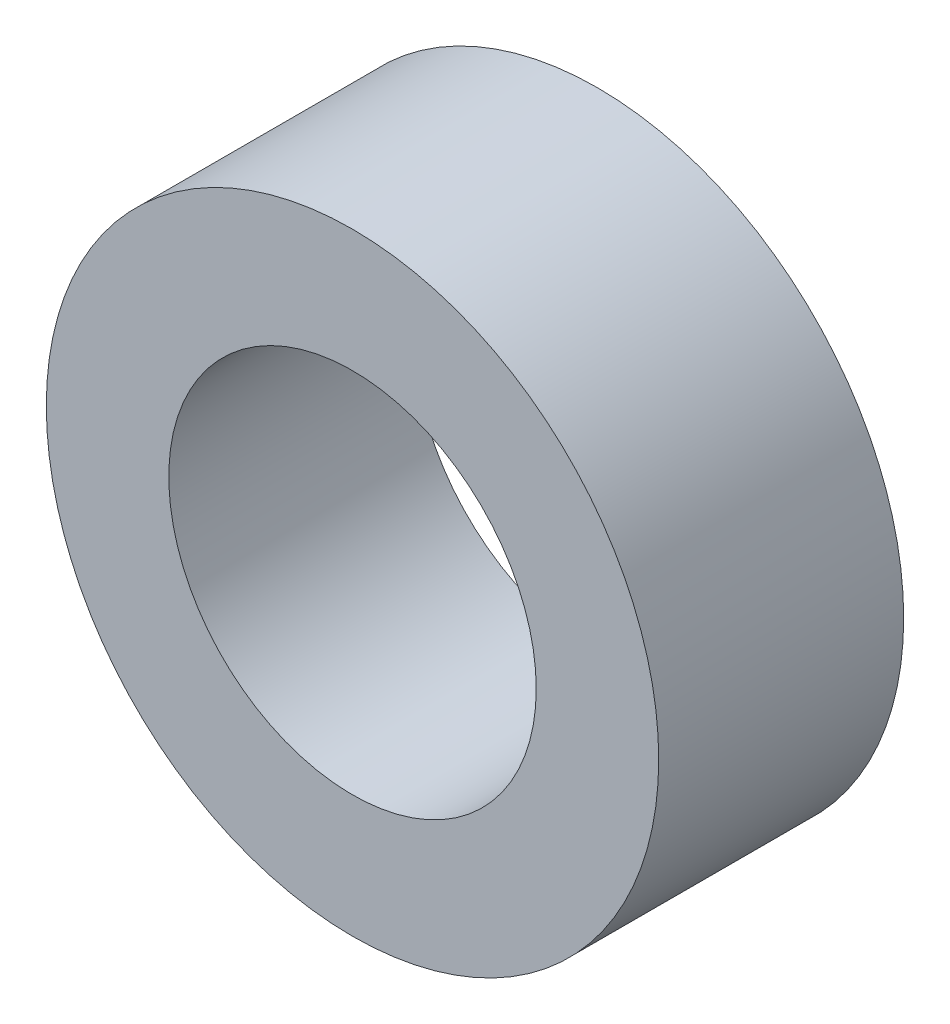
ISO-10303-21;
HEADER;
FILE_DESCRIPTION(('STEP AP214'),'2;1');
FILE_NAME('part.step','',(''),(''),'','','');
FILE_SCHEMA(('AUTOMOTIVE_DESIGN { 1 0 10303 214 1 1 1 1 }'));
ENDSEC;
DATA;
#1=APPLICATION_CONTEXT('core data for automotive mechanical design processes');
#2=APPLICATION_PROTOCOL_DEFINITION('international standard','automotive_design',2000,#1);
#3=PRODUCT_CONTEXT('',#1,'mechanical');
#4=PRODUCT('Part','Part','',(#3));
#5=PRODUCT_RELATED_PRODUCT_CATEGORY('part','',(#4));
#6=PRODUCT_DEFINITION_FORMATION('','',#4);
#7=PRODUCT_DEFINITION_CONTEXT('part definition',#1,'design');
#8=PRODUCT_DEFINITION('design','',#6,#7);
#9=PRODUCT_DEFINITION_SHAPE('','',#8);
#10=(LENGTH_UNIT() NAMED_UNIT(*) SI_UNIT(.MILLI.,.METRE.));
#11=(NAMED_UNIT(*) PLANE_ANGLE_UNIT() SI_UNIT($,.RADIAN.));
#12=(NAMED_UNIT(*) SI_UNIT($,.STERADIAN.) SOLID_ANGLE_UNIT());
#13=UNCERTAINTY_MEASURE_WITH_UNIT(LENGTH_MEASURE(1.E-05),#10,'distance_accuracy_value','');
#14=(GEOMETRIC_REPRESENTATION_CONTEXT(3) GLOBAL_UNCERTAINTY_ASSIGNED_CONTEXT((#13)) GLOBAL_UNIT_ASSIGNED_CONTEXT((#10,
#11,#12)) REPRESENTATION_CONTEXT('',''));
#15=CARTESIAN_POINT('',(0.,0.,0.));
#16=DIRECTION('',(0.,0.,1.));
#17=DIRECTION('',(1.,0.,0.));
#18=AXIS2_PLACEMENT_3D('',#15,#16,#17);
#19=CARTESIAN_POINT('',(-1.22218910772024,0.819515210678698,2.));
#20=DIRECTION('',(0.,0.,1.));
#21=DIRECTION('',(1.,0.,0.));
#22=AXIS2_PLACEMENT_3D('',#19,#20,#21);
#23=PLANE('',#22);
#24=CARTESIAN_POINT('',(-1.22218910772024,0.819515210678698,2.));
#25=DIRECTION('',(0.,0.,1.));
#26=DIRECTION('',(1.,0.,0.));
#27=AXIS2_PLACEMENT_3D('',#24,#25,#26);
#28=CIRCLE('',#27,2.5);
#29=CARTESIAN_POINT('',(1.27781089227976,0.819515210678698,2.));
#30=VERTEX_POINT('',#29);
#31=EDGE_CURVE('E10',#30,#30,#28,.T.);
#32=ORIENTED_EDGE('',*,*,#31,.T.);
#33=EDGE_LOOP('',(#32));
#34=FACE_BOUND('',#33,.T.);
#35=CARTESIAN_POINT('',(-1.22218910772024,0.819515210678698,2.));
#36=DIRECTION('',(0.,0.,1.));
#37=DIRECTION('',(1.,0.,0.));
#38=AXIS2_PLACEMENT_3D('',#35,#36,#37);
#39=CIRCLE('',#38,1.5);
#40=CARTESIAN_POINT('',(0.277810892279758,0.819515210678698,2.));
#41=VERTEX_POINT('',#40);
#42=EDGE_CURVE('E44',#41,#41,#39,.T.);
#43=ORIENTED_EDGE('',*,*,#42,.F.);
#44=EDGE_LOOP('',(#43));
#45=FACE_BOUND('',#44,.T.);
#46=ADVANCED_FACE('F33',(#34,#45),#23,.T.);
#47=CARTESIAN_POINT('',(-1.22218910772024,0.819515210678698,0.));
#48=DIRECTION('',(0.,0.,1.));
#49=DIRECTION('',(1.,0.,0.));
#50=AXIS2_PLACEMENT_3D('',#47,#48,#49);
#51=PLANE('',#50);
#52=CARTESIAN_POINT('',(-1.22218910772024,0.819515210678698,0.));
#53=DIRECTION('',(0.,0.,1.));
#54=DIRECTION('',(1.,0.,0.));
#55=AXIS2_PLACEMENT_3D('',#52,#53,#54);
#56=CIRCLE('',#55,2.5);
#57=CARTESIAN_POINT('',(1.27781089227976,0.819515210678698,0.));
#58=VERTEX_POINT('',#57);
#59=EDGE_CURVE('E37',#58,#58,#56,.T.);
#60=ORIENTED_EDGE('',*,*,#59,.F.);
#61=EDGE_LOOP('',(#60));
#62=FACE_BOUND('',#61,.T.);
#63=CARTESIAN_POINT('',(-1.22218910772024,0.819515210678698,0.));
#64=DIRECTION('',(0.,0.,1.));
#65=DIRECTION('',(1.,0.,0.));
#66=AXIS2_PLACEMENT_3D('',#63,#64,#65);
#67=CIRCLE('',#66,1.5);
#68=CARTESIAN_POINT('',(0.277810892279758,0.819515210678698,0.));
#69=VERTEX_POINT('',#68);
#70=EDGE_CURVE('E46',#69,#69,#67,.T.);
#71=ORIENTED_EDGE('',*,*,#70,.T.);
#72=EDGE_LOOP('',(#71));
#73=FACE_BOUND('',#72,.T.);
#74=ADVANCED_FACE('F56',(#62,#73),#51,.F.);
#75=CARTESIAN_POINT('',(-1.22218910772024,0.819515210678698,2.));
#76=DIRECTION('',(0.,0.,-1.));
#77=DIRECTION('',(-1.,0.,0.));
#78=AXIS2_PLACEMENT_3D('',#75,#76,#77);
#79=CYLINDRICAL_SURFACE('',#78,2.5);
#80=ORIENTED_EDGE('',*,*,#31,.F.);
#81=EDGE_LOOP('',(#80));
#82=FACE_BOUND('',#81,.T.);
#83=ORIENTED_EDGE('',*,*,#59,.T.);
#84=EDGE_LOOP('',(#83));
#85=FACE_BOUND('',#84,.T.);
#86=ADVANCED_FACE('F35',(#82,#85),#79,.T.);
#87=CARTESIAN_POINT('',(-1.22218910772024,0.819515210678698,2.));
#88=DIRECTION('',(0.,0.,-1.));
#89=DIRECTION('',(-1.,0.,0.));
#90=AXIS2_PLACEMENT_3D('',#87,#88,#89);
#91=CYLINDRICAL_SURFACE('',#90,1.5);
#92=ORIENTED_EDGE('',*,*,#42,.T.);
#93=EDGE_LOOP('',(#92));
#94=FACE_BOUND('',#93,.T.);
#95=ORIENTED_EDGE('',*,*,#70,.F.);
#96=EDGE_LOOP('',(#95));
#97=FACE_BOUND('',#96,.T.);
#98=ADVANCED_FACE('F52',(#94,#97),#91,.F.);
#99=CLOSED_SHELL('',(#46,#74,#86,#98));
#100=MANIFOLD_SOLID_BREP('B2',#99);
#101=ADVANCED_BREP_SHAPE_REPRESENTATION('',(#18,#100),#14);
#102=SHAPE_DEFINITION_REPRESENTATION(#9,#101);
ENDSEC;
END-ISO-10303-21;
